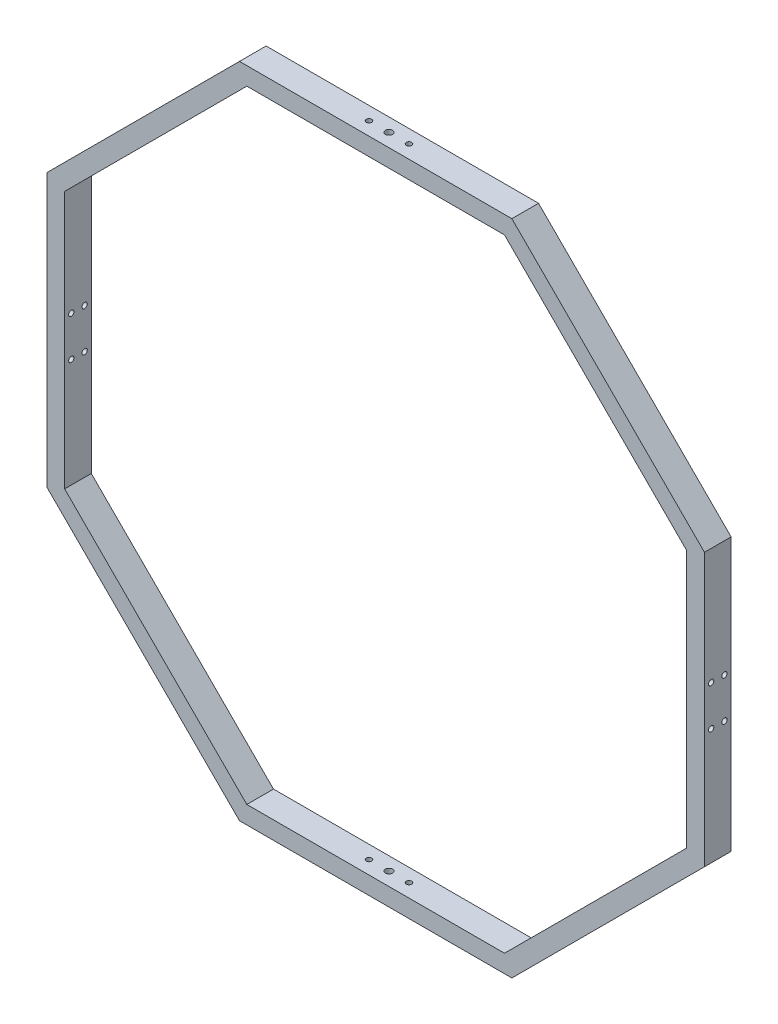
ISO-10303-21;
HEADER;
FILE_DESCRIPTION(('STEP AP214'),'2;1');
FILE_NAME('part.step','',(''),(''),'','','');
FILE_SCHEMA(('AUTOMOTIVE_DESIGN { 1 0 10303 214 1 1 1 1 }'));
ENDSEC;
DATA;
#1=APPLICATION_CONTEXT('core data for automotive mechanical design processes');
#2=APPLICATION_PROTOCOL_DEFINITION('international standard','automotive_design',2000,#1);
#3=PRODUCT_CONTEXT('',#1,'mechanical');
#4=PRODUCT('Part','Part','',(#3));
#5=PRODUCT_RELATED_PRODUCT_CATEGORY('part','',(#4));
#6=PRODUCT_DEFINITION_FORMATION('','',#4);
#7=PRODUCT_DEFINITION_CONTEXT('part definition',#1,'design');
#8=PRODUCT_DEFINITION('design','',#6,#7);
#9=PRODUCT_DEFINITION_SHAPE('','',#8);
#10=(LENGTH_UNIT() NAMED_UNIT(*) SI_UNIT(.MILLI.,.METRE.));
#11=(NAMED_UNIT(*) PLANE_ANGLE_UNIT() SI_UNIT($,.RADIAN.));
#12=(NAMED_UNIT(*) SI_UNIT($,.STERADIAN.) SOLID_ANGLE_UNIT());
#13=UNCERTAINTY_MEASURE_WITH_UNIT(LENGTH_MEASURE(1.E-05),#10,'distance_accuracy_value','');
#14=(GEOMETRIC_REPRESENTATION_CONTEXT(3) GLOBAL_UNCERTAINTY_ASSIGNED_CONTEXT((#13)) GLOBAL_UNIT_ASSIGNED_CONTEXT((#10,
#11,#12)) REPRESENTATION_CONTEXT('',''));
#15=CARTESIAN_POINT('',(0.,0.,0.));
#16=DIRECTION('',(0.,0.,1.));
#17=DIRECTION('',(1.,0.,0.));
#18=AXIS2_PLACEMENT_3D('',#15,#16,#17);
#19=CARTESIAN_POINT('',(0.,0.,60.));
#20=DIRECTION('',(0.,0.,1.));
#21=DIRECTION('',(1.,0.,0.));
#22=AXIS2_PLACEMENT_3D('',#19,#20,#21);
#23=PLANE('',#22);
#24=DIRECTION('',(0.,1.,0.));
#25=VECTOR('',#24,1.);
#26=CARTESIAN_POINT('',(740.,-306.51803615609,60.));
#27=LINE('',#26,#25);
#28=CARTESIAN_POINT('',(740.,-306.51803615609,60.));
#29=VERTEX_POINT('',#28);
#30=CARTESIAN_POINT('',(740.,306.51803615609,60.));
#31=VERTEX_POINT('',#30);
#32=EDGE_CURVE('E248',#29,#31,#27,.T.);
#33=ORIENTED_EDGE('',*,*,#32,.T.);
#34=DIRECTION('',(-0.707106781186547,0.707106781186547,0.));
#35=VECTOR('',#34,1.);
#36=CARTESIAN_POINT('',(740.,306.51803615609,60.));
#37=LINE('',#36,#35);
#38=CARTESIAN_POINT('',(306.51803615609,740.,60.));
#39=VERTEX_POINT('',#38);
#40=EDGE_CURVE('E252',#31,#39,#37,.T.);
#41=ORIENTED_EDGE('',*,*,#40,.T.);
#42=DIRECTION('',(-1.,0.,0.));
#43=VECTOR('',#42,1.);
#44=CARTESIAN_POINT('',(306.51803615609,740.,60.));
#45=LINE('',#44,#43);
#46=CARTESIAN_POINT('',(-306.51803615609,740.,60.));
#47=VERTEX_POINT('',#46);
#48=EDGE_CURVE('E256',#39,#47,#45,.T.);
#49=ORIENTED_EDGE('',*,*,#48,.T.);
#50=DIRECTION('',(-0.707106781186548,-0.707106781186547,0.));
#51=VECTOR('',#50,1.);
#52=CARTESIAN_POINT('',(-306.51803615609,740.,60.));
#53=LINE('',#52,#51);
#54=CARTESIAN_POINT('',(-740.,306.51803615609,60.));
#55=VERTEX_POINT('',#54);
#56=EDGE_CURVE('E259',#47,#55,#53,.T.);
#57=ORIENTED_EDGE('',*,*,#56,.T.);
#58=DIRECTION('',(0.,-1.,0.));
#59=VECTOR('',#58,1.);
#60=CARTESIAN_POINT('',(-740.,306.51803615609,60.));
#61=LINE('',#60,#59);
#62=CARTESIAN_POINT('',(-740.,-306.518036156091,60.));
#63=VERTEX_POINT('',#62);
#64=EDGE_CURVE('E262',#55,#63,#61,.T.);
#65=ORIENTED_EDGE('',*,*,#64,.T.);
#66=DIRECTION('',(0.707106781186548,-0.707106781186547,0.));
#67=VECTOR('',#66,1.);
#68=CARTESIAN_POINT('',(-740.,-306.518036156091,60.));
#69=LINE('',#68,#67);
#70=CARTESIAN_POINT('',(-306.51803615609,-740.,60.));
#71=VERTEX_POINT('',#70);
#72=EDGE_CURVE('E265',#63,#71,#69,.T.);
#73=ORIENTED_EDGE('',*,*,#72,.T.);
#74=DIRECTION('',(1.,0.,0.));
#75=VECTOR('',#74,1.);
#76=CARTESIAN_POINT('',(-306.51803615609,-740.,60.));
#77=LINE('',#76,#75);
#78=CARTESIAN_POINT('',(306.51803615609,-740.,60.));
#79=VERTEX_POINT('',#78);
#80=EDGE_CURVE('E268',#71,#79,#77,.T.);
#81=ORIENTED_EDGE('',*,*,#80,.T.);
#82=DIRECTION('',(0.707106781186548,0.707106781186548,0.));
#83=VECTOR('',#82,1.);
#84=CARTESIAN_POINT('',(306.51803615609,-740.,60.));
#85=LINE('',#84,#83);
#86=EDGE_CURVE('E271',#79,#29,#85,.T.);
#87=ORIENTED_EDGE('',*,*,#86,.T.);
#88=EDGE_LOOP('',(#33,#41,#49,#57,#65,#73,#81,#87));
#89=FACE_BOUND('',#88,.T.);
#90=DIRECTION('',(0.,1.,0.));
#91=VECTOR('',#90,1.);
#92=CARTESIAN_POINT('',(700.,-289.949493661166,60.));
#93=LINE('',#92,#91);
#94=CARTESIAN_POINT('',(700.,-289.949493661166,60.));
#95=VERTEX_POINT('',#94);
#96=CARTESIAN_POINT('',(700.,289.949493661167,60.));
#97=VERTEX_POINT('',#96);
#98=EDGE_CURVE('E165',#95,#97,#93,.T.);
#99=ORIENTED_EDGE('',*,*,#98,.F.);
#100=DIRECTION('',(0.707106781186547,0.707106781186548,0.));
#101=VECTOR('',#100,1.);
#102=CARTESIAN_POINT('',(289.949493661166,-700.,60.));
#103=LINE('',#102,#101);
#104=CARTESIAN_POINT('',(289.949493661166,-700.,60.));
#105=VERTEX_POINT('',#104);
#106=EDGE_CURVE('E156',#105,#95,#103,.T.);
#107=ORIENTED_EDGE('',*,*,#106,.F.);
#108=DIRECTION('',(1.,0.,0.));
#109=VECTOR('',#108,1.);
#110=CARTESIAN_POINT('',(-289.949493661166,-700.,60.));
#111=LINE('',#110,#109);
#112=CARTESIAN_POINT('',(-289.949493661166,-700.,60.));
#113=VERTEX_POINT('',#112);
#114=EDGE_CURVE('E199',#113,#105,#111,.T.);
#115=ORIENTED_EDGE('',*,*,#114,.F.);
#116=DIRECTION('',(0.707106781186548,-0.707106781186547,0.));
#117=VECTOR('',#116,1.);
#118=CARTESIAN_POINT('',(-700.,-289.949493661167,60.));
#119=LINE('',#118,#117);
#120=CARTESIAN_POINT('',(-700.,-289.949493661167,60.));
#121=VERTEX_POINT('',#120);
#122=EDGE_CURVE('E196',#121,#113,#119,.T.);
#123=ORIENTED_EDGE('',*,*,#122,.F.);
#124=DIRECTION('',(0.,-1.,0.));
#125=VECTOR('',#124,1.);
#126=CARTESIAN_POINT('',(-700.,289.949493661166,60.));
#127=LINE('',#126,#125);
#128=CARTESIAN_POINT('',(-700.,289.949493661166,60.));
#129=VERTEX_POINT('',#128);
#130=EDGE_CURVE('E193',#129,#121,#127,.T.);
#131=ORIENTED_EDGE('',*,*,#130,.F.);
#132=DIRECTION('',(-0.707106781186547,-0.707106781186548,0.));
#133=VECTOR('',#132,1.);
#134=CARTESIAN_POINT('',(-289.949493661167,700.,60.));
#135=LINE('',#134,#133);
#136=CARTESIAN_POINT('',(-289.949493661167,700.,60.));
#137=VERTEX_POINT('',#136);
#138=EDGE_CURVE('E190',#137,#129,#135,.T.);
#139=ORIENTED_EDGE('',*,*,#138,.F.);
#140=DIRECTION('',(-1.,0.,0.));
#141=VECTOR('',#140,1.);
#142=CARTESIAN_POINT('',(289.949493661166,700.,60.));
#143=LINE('',#142,#141);
#144=CARTESIAN_POINT('',(289.949493661166,700.,60.));
#145=VERTEX_POINT('',#144);
#146=EDGE_CURVE('E184',#145,#137,#143,.T.);
#147=ORIENTED_EDGE('',*,*,#146,.F.);
#148=DIRECTION('',(-0.707106781186548,0.707106781186547,0.));
#149=VECTOR('',#148,1.);
#150=CARTESIAN_POINT('',(700.,289.949493661167,60.));
#151=LINE('',#150,#149);
#152=EDGE_CURVE('E179',#97,#145,#151,.T.);
#153=ORIENTED_EDGE('',*,*,#152,.F.);
#154=EDGE_LOOP('',(#99,#107,#115,#123,#131,#139,#147,#153));
#155=FACE_BOUND('',#154,.T.);
#156=ADVANCED_FACE('F40',(#89,#155),#23,.T.);
#157=CARTESIAN_POINT('',(0.,0.,0.));
#158=DIRECTION('',(0.,0.,1.));
#159=DIRECTION('',(1.,0.,0.));
#160=AXIS2_PLACEMENT_3D('',#157,#158,#159);
#161=PLANE('',#160);
#162=DIRECTION('',(0.,1.,0.));
#163=VECTOR('',#162,1.);
#164=CARTESIAN_POINT('',(740.,-306.51803615609,0.));
#165=LINE('',#164,#163);
#166=CARTESIAN_POINT('',(740.,-306.51803615609,0.));
#167=VERTEX_POINT('',#166);
#168=CARTESIAN_POINT('',(740.,306.51803615609,0.));
#169=VERTEX_POINT('',#168);
#170=EDGE_CURVE('E174',#167,#169,#165,.T.);
#171=ORIENTED_EDGE('',*,*,#170,.F.);
#172=DIRECTION('',(0.707106781186548,0.707106781186548,0.));
#173=VECTOR('',#172,1.);
#174=CARTESIAN_POINT('',(306.51803615609,-740.,0.));
#175=LINE('',#174,#173);
#176=CARTESIAN_POINT('',(306.51803615609,-740.,0.));
#177=VERTEX_POINT('',#176);
#178=EDGE_CURVE('E253',#177,#167,#175,.T.);
#179=ORIENTED_EDGE('',*,*,#178,.F.);
#180=DIRECTION('',(1.,0.,0.));
#181=VECTOR('',#180,1.);
#182=CARTESIAN_POINT('',(-306.51803615609,-740.,0.));
#183=LINE('',#182,#181);
#184=CARTESIAN_POINT('',(-306.51803615609,-740.,0.));
#185=VERTEX_POINT('',#184);
#186=EDGE_CURVE('E293',#185,#177,#183,.T.);
#187=ORIENTED_EDGE('',*,*,#186,.F.);
#188=DIRECTION('',(0.707106781186548,-0.707106781186547,0.));
#189=VECTOR('',#188,1.);
#190=CARTESIAN_POINT('',(-740.,-306.518036156091,0.));
#191=LINE('',#190,#189);
#192=CARTESIAN_POINT('',(-740.,-306.518036156091,0.));
#193=VERTEX_POINT('',#192);
#194=EDGE_CURVE('E290',#193,#185,#191,.T.);
#195=ORIENTED_EDGE('',*,*,#194,.F.);
#196=DIRECTION('',(0.,-1.,0.));
#197=VECTOR('',#196,1.);
#198=CARTESIAN_POINT('',(-740.,306.51803615609,0.));
#199=LINE('',#198,#197);
#200=CARTESIAN_POINT('',(-740.,306.51803615609,0.));
#201=VERTEX_POINT('',#200);
#202=EDGE_CURVE('E287',#201,#193,#199,.T.);
#203=ORIENTED_EDGE('',*,*,#202,.F.);
#204=DIRECTION('',(-0.707106781186548,-0.707106781186547,0.));
#205=VECTOR('',#204,1.);
#206=CARTESIAN_POINT('',(-306.51803615609,740.,0.));
#207=LINE('',#206,#205);
#208=CARTESIAN_POINT('',(-306.51803615609,740.,0.));
#209=VERTEX_POINT('',#208);
#210=EDGE_CURVE('E284',#209,#201,#207,.T.);
#211=ORIENTED_EDGE('',*,*,#210,.F.);
#212=DIRECTION('',(-1.,0.,0.));
#213=VECTOR('',#212,1.);
#214=CARTESIAN_POINT('',(306.51803615609,740.,0.));
#215=LINE('',#214,#213);
#216=CARTESIAN_POINT('',(306.51803615609,740.,0.));
#217=VERTEX_POINT('',#216);
#218=EDGE_CURVE('E281',#217,#209,#215,.T.);
#219=ORIENTED_EDGE('',*,*,#218,.F.);
#220=DIRECTION('',(-0.707106781186547,0.707106781186547,0.));
#221=VECTOR('',#220,1.);
#222=CARTESIAN_POINT('',(740.,306.51803615609,0.));
#223=LINE('',#222,#221);
#224=EDGE_CURVE('E278',#169,#217,#223,.T.);
#225=ORIENTED_EDGE('',*,*,#224,.F.);
#226=EDGE_LOOP('',(#171,#179,#187,#195,#203,#211,#219,#225));
#227=FACE_BOUND('',#226,.T.);
#228=DIRECTION('',(0.707106781186547,0.707106781186548,0.));
#229=VECTOR('',#228,1.);
#230=CARTESIAN_POINT('',(289.949493661166,-700.,0.));
#231=LINE('',#230,#229);
#232=CARTESIAN_POINT('',(289.949493661166,-700.,0.));
#233=VERTEX_POINT('',#232);
#234=CARTESIAN_POINT('',(700.,-289.949493661166,0.));
#235=VERTEX_POINT('',#234);
#236=EDGE_CURVE('E66',#233,#235,#231,.T.);
#237=ORIENTED_EDGE('',*,*,#236,.T.);
#238=DIRECTION('',(0.,1.,0.));
#239=VECTOR('',#238,1.);
#240=CARTESIAN_POINT('',(700.,-289.949493661166,0.));
#241=LINE('',#240,#239);
#242=CARTESIAN_POINT('',(700.,289.949493661167,0.));
#243=VERTEX_POINT('',#242);
#244=EDGE_CURVE('E172',#235,#243,#241,.T.);
#245=ORIENTED_EDGE('',*,*,#244,.T.);
#246=DIRECTION('',(-0.707106781186548,0.707106781186547,0.));
#247=VECTOR('',#246,1.);
#248=CARTESIAN_POINT('',(700.,289.949493661167,0.));
#249=LINE('',#248,#247);
#250=CARTESIAN_POINT('',(289.949493661166,700.,0.));
#251=VERTEX_POINT('',#250);
#252=EDGE_CURVE('E207',#243,#251,#249,.T.);
#253=ORIENTED_EDGE('',*,*,#252,.T.);
#254=DIRECTION('',(-1.,0.,0.));
#255=VECTOR('',#254,1.);
#256=CARTESIAN_POINT('',(289.949493661166,700.,0.));
#257=LINE('',#256,#255);
#258=CARTESIAN_POINT('',(-289.949493661167,700.,0.));
#259=VERTEX_POINT('',#258);
#260=EDGE_CURVE('E211',#251,#259,#257,.T.);
#261=ORIENTED_EDGE('',*,*,#260,.T.);
#262=DIRECTION('',(-0.707106781186547,-0.707106781186548,0.));
#263=VECTOR('',#262,1.);
#264=CARTESIAN_POINT('',(-289.949493661167,700.,0.));
#265=LINE('',#264,#263);
#266=CARTESIAN_POINT('',(-700.,289.949493661166,0.));
#267=VERTEX_POINT('',#266);
#268=EDGE_CURVE('E215',#259,#267,#265,.T.);
#269=ORIENTED_EDGE('',*,*,#268,.T.);
#270=DIRECTION('',(0.,-1.,0.));
#271=VECTOR('',#270,1.);
#272=CARTESIAN_POINT('',(-700.,289.949493661166,0.));
#273=LINE('',#272,#271);
#274=CARTESIAN_POINT('',(-700.,-289.949493661167,0.));
#275=VERTEX_POINT('',#274);
#276=EDGE_CURVE('E219',#267,#275,#273,.T.);
#277=ORIENTED_EDGE('',*,*,#276,.T.);
#278=DIRECTION('',(0.707106781186548,-0.707106781186547,0.));
#279=VECTOR('',#278,1.);
#280=CARTESIAN_POINT('',(-700.,-289.949493661167,0.));
#281=LINE('',#280,#279);
#282=CARTESIAN_POINT('',(-289.949493661166,-700.,0.));
#283=VERTEX_POINT('',#282);
#284=EDGE_CURVE('E223',#275,#283,#281,.T.);
#285=ORIENTED_EDGE('',*,*,#284,.T.);
#286=DIRECTION('',(1.,0.,0.));
#287=VECTOR('',#286,1.);
#288=CARTESIAN_POINT('',(-289.949493661166,-700.,0.));
#289=LINE('',#288,#287);
#290=EDGE_CURVE('E166',#283,#233,#289,.T.);
#291=ORIENTED_EDGE('',*,*,#290,.T.);
#292=EDGE_LOOP('',(#237,#245,#253,#261,#269,#277,#285,#291));
#293=FACE_BOUND('',#292,.T.);
#294=ADVANCED_FACE('F444',(#227,#293),#161,.F.);
#295=CARTESIAN_POINT('',(740.,-306.51803615609,60.));
#296=DIRECTION('',(-1.,0.,0.));
#297=DIRECTION('',(0.,0.,1.));
#298=AXIS2_PLACEMENT_3D('',#295,#296,#297);
#299=PLANE('',#298);
#300=CARTESIAN_POINT('',(740.,-45.,15.));
#301=DIRECTION('',(1.,0.,0.));
#302=DIRECTION('',(0.,0.,-1.));
#303=AXIS2_PLACEMENT_3D('',#300,#301,#302);
#304=CIRCLE('',#303,6.);
#305=CARTESIAN_POINT('',(740.,-45.,8.99999999999999));
#306=VERTEX_POINT('',#305);
#307=EDGE_CURVE('E657',#306,#306,#304,.T.);
#308=ORIENTED_EDGE('',*,*,#307,.F.);
#309=EDGE_LOOP('',(#308));
#310=FACE_BOUND('',#309,.T.);
#311=CARTESIAN_POINT('',(740.,45.,45.));
#312=DIRECTION('',(1.,0.,0.));
#313=DIRECTION('',(0.,0.,-1.));
#314=AXIS2_PLACEMENT_3D('',#311,#312,#313);
#315=CIRCLE('',#314,6.);
#316=CARTESIAN_POINT('',(740.,45.,39.));
#317=VERTEX_POINT('',#316);
#318=EDGE_CURVE('E659',#317,#317,#315,.T.);
#319=ORIENTED_EDGE('',*,*,#318,.F.);
#320=EDGE_LOOP('',(#319));
#321=FACE_BOUND('',#320,.T.);
#322=CARTESIAN_POINT('',(740.,-45.,45.));
#323=DIRECTION('',(1.,0.,0.));
#324=DIRECTION('',(0.,0.,-1.));
#325=AXIS2_PLACEMENT_3D('',#322,#323,#324);
#326=CIRCLE('',#325,6.);
#327=CARTESIAN_POINT('',(740.,-45.,39.));
#328=VERTEX_POINT('',#327);
#329=EDGE_CURVE('E667',#328,#328,#326,.T.);
#330=ORIENTED_EDGE('',*,*,#329,.F.);
#331=EDGE_LOOP('',(#330));
#332=FACE_BOUND('',#331,.T.);
#333=CARTESIAN_POINT('',(740.,45.,15.));
#334=DIRECTION('',(1.,0.,0.));
#335=DIRECTION('',(0.,0.,-1.));
#336=AXIS2_PLACEMENT_3D('',#333,#334,#335);
#337=CIRCLE('',#336,6.);
#338=CARTESIAN_POINT('',(740.,45.,9.));
#339=VERTEX_POINT('',#338);
#340=EDGE_CURVE('E347',#339,#339,#337,.T.);
#341=ORIENTED_EDGE('',*,*,#340,.F.);
#342=EDGE_LOOP('',(#341));
#343=FACE_BOUND('',#342,.T.);
#344=ORIENTED_EDGE('',*,*,#170,.T.);
#345=DIRECTION('',(0.,0.,-1.));
#346=VECTOR('',#345,1.);
#347=CARTESIAN_POINT('',(740.,306.51803615609,60.));
#348=LINE('',#347,#346);
#349=EDGE_CURVE('E11',#31,#169,#348,.T.);
#350=ORIENTED_EDGE('',*,*,#349,.F.);
#351=ORIENTED_EDGE('',*,*,#32,.F.);
#352=DIRECTION('',(0.,0.,-1.));
#353=VECTOR('',#352,1.);
#354=CARTESIAN_POINT('',(740.,-306.51803615609,60.));
#355=LINE('',#354,#353);
#356=EDGE_CURVE('E274',#29,#167,#355,.T.);
#357=ORIENTED_EDGE('',*,*,#356,.T.);
#358=EDGE_LOOP('',(#344,#350,#351,#357));
#359=FACE_BOUND('',#358,.T.);
#360=ADVANCED_FACE('F42',(#310,#321,#332,#343,#359),#299,.F.);
#361=CARTESIAN_POINT('',(740.,306.51803615609,60.));
#362=DIRECTION('',(-0.707106781186547,-0.707106781186547,0.));
#363=DIRECTION('',(0.707106781186548,-0.707106781186548,0.));
#364=AXIS2_PLACEMENT_3D('',#361,#362,#363);
#365=PLANE('',#364);
#366=ORIENTED_EDGE('',*,*,#224,.T.);
#367=DIRECTION('',(0.,0.,-1.));
#368=VECTOR('',#367,1.);
#369=CARTESIAN_POINT('',(306.51803615609,740.,60.));
#370=LINE('',#369,#368);
#371=EDGE_CURVE('E50',#39,#217,#370,.T.);
#372=ORIENTED_EDGE('',*,*,#371,.F.);
#373=ORIENTED_EDGE('',*,*,#40,.F.);
#374=ORIENTED_EDGE('',*,*,#349,.T.);
#375=EDGE_LOOP('',(#366,#372,#373,#374));
#376=FACE_BOUND('',#375,.T.);
#377=ADVANCED_FACE('F476',(#376),#365,.F.);
#378=CARTESIAN_POINT('',(306.51803615609,740.,60.));
#379=DIRECTION('',(0.,-1.,0.));
#380=DIRECTION('',(0.,0.,-1.));
#381=AXIS2_PLACEMENT_3D('',#378,#379,#380);
#382=PLANE('',#381);
#383=CARTESIAN_POINT('',(45.,740.,30.));
#384=DIRECTION('',(0.,-1.,0.));
#385=DIRECTION('',(0.,0.,-1.));
#386=AXIS2_PLACEMENT_3D('',#383,#384,#385);
#387=CIRCLE('',#386,6.);
#388=CARTESIAN_POINT('',(45.,740.,24.));
#389=VERTEX_POINT('',#388);
#390=EDGE_CURVE('E204',#389,#389,#387,.T.);
#391=ORIENTED_EDGE('',*,*,#390,.T.);
#392=EDGE_LOOP('',(#391));
#393=FACE_BOUND('',#392,.T.);
#394=CARTESIAN_POINT('',(-45.,740.,30.));
#395=DIRECTION('',(0.,-1.,0.));
#396=DIRECTION('',(0.,0.,-1.));
#397=AXIS2_PLACEMENT_3D('',#394,#395,#396);
#398=CIRCLE('',#397,6.);
#399=CARTESIAN_POINT('',(-45.,740.,24.));
#400=VERTEX_POINT('',#399);
#401=EDGE_CURVE('E341',#400,#400,#398,.T.);
#402=ORIENTED_EDGE('',*,*,#401,.T.);
#403=EDGE_LOOP('',(#402));
#404=FACE_BOUND('',#403,.T.);
#405=CARTESIAN_POINT('',(0.,740.,30.));
#406=DIRECTION('',(0.,-1.,0.));
#407=DIRECTION('',(0.,0.,-1.));
#408=AXIS2_PLACEMENT_3D('',#405,#406,#407);
#409=CIRCLE('',#408,8.);
#410=CARTESIAN_POINT('',(0.,740.,22.));
#411=VERTEX_POINT('',#410);
#412=EDGE_CURVE('E335',#411,#411,#409,.T.);
#413=ORIENTED_EDGE('',*,*,#412,.T.);
#414=EDGE_LOOP('',(#413));
#415=FACE_BOUND('',#414,.T.);
#416=ORIENTED_EDGE('',*,*,#218,.T.);
#417=DIRECTION('',(0.,0.,-1.));
#418=VECTOR('',#417,1.);
#419=CARTESIAN_POINT('',(-306.51803615609,740.,60.));
#420=LINE('',#419,#418);
#421=EDGE_CURVE('E317',#47,#209,#420,.T.);
#422=ORIENTED_EDGE('',*,*,#421,.F.);
#423=ORIENTED_EDGE('',*,*,#48,.F.);
#424=ORIENTED_EDGE('',*,*,#371,.T.);
#425=EDGE_LOOP('',(#416,#422,#423,#424));
#426=FACE_BOUND('',#425,.T.);
#427=ADVANCED_FACE('F417',(#393,#404,#415,#426),#382,.F.);
#428=CARTESIAN_POINT('',(-306.51803615609,740.,60.));
#429=DIRECTION('',(0.707106781186547,-0.707106781186548,0.));
#430=DIRECTION('',(0.707106781186548,0.707106781186547,0.));
#431=AXIS2_PLACEMENT_3D('',#428,#429,#430);
#432=PLANE('',#431);
#433=ORIENTED_EDGE('',*,*,#210,.T.);
#434=DIRECTION('',(0.,0.,-1.));
#435=VECTOR('',#434,1.);
#436=CARTESIAN_POINT('',(-740.,306.51803615609,60.));
#437=LINE('',#436,#435);
#438=EDGE_CURVE('E313',#55,#201,#437,.T.);
#439=ORIENTED_EDGE('',*,*,#438,.F.);
#440=ORIENTED_EDGE('',*,*,#56,.F.);
#441=ORIENTED_EDGE('',*,*,#421,.T.);
#442=EDGE_LOOP('',(#433,#439,#440,#441));
#443=FACE_BOUND('',#442,.T.);
#444=ADVANCED_FACE('F470',(#443),#432,.F.);
#445=CARTESIAN_POINT('',(-740.,306.51803615609,60.));
#446=DIRECTION('',(1.,0.,0.));
#447=DIRECTION('',(0.,0.,-1.));
#448=AXIS2_PLACEMENT_3D('',#445,#446,#447);
#449=PLANE('',#448);
#450=CARTESIAN_POINT('',(-740.,-45.,15.));
#451=DIRECTION('',(1.,0.,0.));
#452=DIRECTION('',(0.,0.,-1.));
#453=AXIS2_PLACEMENT_3D('',#450,#451,#452);
#454=CIRCLE('',#453,6.);
#455=CARTESIAN_POINT('',(-740.,-45.,8.99999999999999));
#456=VERTEX_POINT('',#455);
#457=EDGE_CURVE('E383',#456,#456,#454,.T.);
#458=ORIENTED_EDGE('',*,*,#457,.T.);
#459=EDGE_LOOP('',(#458));
#460=FACE_BOUND('',#459,.T.);
#461=CARTESIAN_POINT('',(-740.,45.,45.));
#462=DIRECTION('',(1.,0.,0.));
#463=DIRECTION('',(0.,0.,-1.));
#464=AXIS2_PLACEMENT_3D('',#461,#462,#463);
#465=CIRCLE('',#464,6.);
#466=CARTESIAN_POINT('',(-740.,45.,39.));
#467=VERTEX_POINT('',#466);
#468=EDGE_CURVE('E364',#467,#467,#465,.T.);
#469=ORIENTED_EDGE('',*,*,#468,.T.);
#470=EDGE_LOOP('',(#469));
#471=FACE_BOUND('',#470,.T.);
#472=CARTESIAN_POINT('',(-740.,-45.,45.));
#473=DIRECTION('',(1.,0.,0.));
#474=DIRECTION('',(0.,0.,-1.));
#475=AXIS2_PLACEMENT_3D('',#472,#473,#474);
#476=CIRCLE('',#475,6.);
#477=CARTESIAN_POINT('',(-740.,-45.,39.));
#478=VERTEX_POINT('',#477);
#479=EDGE_CURVE('E357',#478,#478,#476,.T.);
#480=ORIENTED_EDGE('',*,*,#479,.T.);
#481=EDGE_LOOP('',(#480));
#482=FACE_BOUND('',#481,.T.);
#483=CARTESIAN_POINT('',(-740.,45.,15.));
#484=DIRECTION('',(1.,0.,0.));
#485=DIRECTION('',(0.,0.,-1.));
#486=AXIS2_PLACEMENT_3D('',#483,#484,#485);
#487=CIRCLE('',#486,6.);
#488=CARTESIAN_POINT('',(-740.,45.,9.));
#489=VERTEX_POINT('',#488);
#490=EDGE_CURVE('E352',#489,#489,#487,.T.);
#491=ORIENTED_EDGE('',*,*,#490,.T.);
#492=EDGE_LOOP('',(#491));
#493=FACE_BOUND('',#492,.T.);
#494=ORIENTED_EDGE('',*,*,#202,.T.);
#495=DIRECTION('',(0.,0.,-1.));
#496=VECTOR('',#495,1.);
#497=CARTESIAN_POINT('',(-740.,-306.518036156091,60.));
#498=LINE('',#497,#496);
#499=EDGE_CURVE('E309',#63,#193,#498,.T.);
#500=ORIENTED_EDGE('',*,*,#499,.F.);
#501=ORIENTED_EDGE('',*,*,#64,.F.);
#502=ORIENTED_EDGE('',*,*,#438,.T.);
#503=EDGE_LOOP('',(#494,#500,#501,#502));
#504=FACE_BOUND('',#503,.T.);
#505=ADVANCED_FACE('F466',(#460,#471,#482,#493,#504),#449,.F.);
#506=CARTESIAN_POINT('',(-740.,-306.518036156091,60.));
#507=DIRECTION('',(0.707106781186547,0.707106781186548,0.));
#508=DIRECTION('',(-0.707106781186548,0.707106781186547,0.));
#509=AXIS2_PLACEMENT_3D('',#506,#507,#508);
#510=PLANE('',#509);
#511=ORIENTED_EDGE('',*,*,#194,.T.);
#512=DIRECTION('',(0.,0.,-1.));
#513=VECTOR('',#512,1.);
#514=CARTESIAN_POINT('',(-306.51803615609,-740.,60.));
#515=LINE('',#514,#513);
#516=EDGE_CURVE('E305',#71,#185,#515,.T.);
#517=ORIENTED_EDGE('',*,*,#516,.F.);
#518=ORIENTED_EDGE('',*,*,#72,.F.);
#519=ORIENTED_EDGE('',*,*,#499,.T.);
#520=EDGE_LOOP('',(#511,#517,#518,#519));
#521=FACE_BOUND('',#520,.T.);
#522=ADVANCED_FACE('F462',(#521),#510,.F.);
#523=CARTESIAN_POINT('',(-306.51803615609,-740.,60.));
#524=DIRECTION('',(0.,1.,0.));
#525=DIRECTION('',(0.,0.,1.));
#526=AXIS2_PLACEMENT_3D('',#523,#524,#525);
#527=PLANE('',#526);
#528=CARTESIAN_POINT('',(45.,-740.,30.));
#529=DIRECTION('',(0.,-1.,0.));
#530=DIRECTION('',(0.,0.,-1.));
#531=AXIS2_PLACEMENT_3D('',#528,#529,#530);
#532=CIRCLE('',#531,6.);
#533=CARTESIAN_POINT('',(45.,-740.,24.));
#534=VERTEX_POINT('',#533);
#535=EDGE_CURVE('E387',#534,#534,#532,.T.);
#536=ORIENTED_EDGE('',*,*,#535,.F.);
#537=EDGE_LOOP('',(#536));
#538=FACE_BOUND('',#537,.T.);
#539=CARTESIAN_POINT('',(-45.,-740.,30.));
#540=DIRECTION('',(0.,-1.,0.));
#541=DIRECTION('',(0.,0.,-1.));
#542=AXIS2_PLACEMENT_3D('',#539,#540,#541);
#543=CIRCLE('',#542,6.);
#544=CARTESIAN_POINT('',(-45.,-740.,24.));
#545=VERTEX_POINT('',#544);
#546=EDGE_CURVE('E388',#545,#545,#543,.T.);
#547=ORIENTED_EDGE('',*,*,#546,.F.);
#548=EDGE_LOOP('',(#547));
#549=FACE_BOUND('',#548,.T.);
#550=CARTESIAN_POINT('',(0.,-740.,30.));
#551=DIRECTION('',(0.,-1.,0.));
#552=DIRECTION('',(0.,0.,-1.));
#553=AXIS2_PLACEMENT_3D('',#550,#551,#552);
#554=CIRCLE('',#553,8.);
#555=CARTESIAN_POINT('',(0.,-740.,22.));
#556=VERTEX_POINT('',#555);
#557=EDGE_CURVE('E329',#556,#556,#554,.T.);
#558=ORIENTED_EDGE('',*,*,#557,.F.);
#559=EDGE_LOOP('',(#558));
#560=FACE_BOUND('',#559,.T.);
#561=ORIENTED_EDGE('',*,*,#186,.T.);
#562=DIRECTION('',(0.,0.,-1.));
#563=VECTOR('',#562,1.);
#564=CARTESIAN_POINT('',(306.51803615609,-740.,60.));
#565=LINE('',#564,#563);
#566=EDGE_CURVE('E301',#79,#177,#565,.T.);
#567=ORIENTED_EDGE('',*,*,#566,.F.);
#568=ORIENTED_EDGE('',*,*,#80,.F.);
#569=ORIENTED_EDGE('',*,*,#516,.T.);
#570=EDGE_LOOP('',(#561,#567,#568,#569));
#571=FACE_BOUND('',#570,.T.);
#572=ADVANCED_FACE('F458',(#538,#549,#560,#571),#527,.F.);
#573=CARTESIAN_POINT('',(306.51803615609,-740.,60.));
#574=DIRECTION('',(-0.707106781186547,0.707106781186547,0.));
#575=DIRECTION('',(-0.707106781186548,-0.707106781186548,0.));
#576=AXIS2_PLACEMENT_3D('',#573,#574,#575);
#577=PLANE('',#576);
#578=ORIENTED_EDGE('',*,*,#178,.T.);
#579=ORIENTED_EDGE('',*,*,#356,.F.);
#580=ORIENTED_EDGE('',*,*,#86,.F.);
#581=ORIENTED_EDGE('',*,*,#566,.T.);
#582=EDGE_LOOP('',(#578,#579,#580,#581));
#583=FACE_BOUND('',#582,.T.);
#584=ADVANCED_FACE('F455',(#583),#577,.F.);
#585=CARTESIAN_POINT('',(289.949493661166,-700.,60.));
#586=DIRECTION('',(-0.707106781186548,0.707106781186547,0.));
#587=DIRECTION('',(-0.707106781186547,-0.707106781186548,0.));
#588=AXIS2_PLACEMENT_3D('',#585,#586,#587);
#589=PLANE('',#588);
#590=ORIENTED_EDGE('',*,*,#236,.F.);
#591=DIRECTION('',(0.,0.,-1.));
#592=VECTOR('',#591,1.);
#593=CARTESIAN_POINT('',(289.949493661166,-700.,60.));
#594=LINE('',#593,#592);
#595=EDGE_CURVE('E160',#105,#233,#594,.T.);
#596=ORIENTED_EDGE('',*,*,#595,.F.);
#597=ORIENTED_EDGE('',*,*,#106,.T.);
#598=DIRECTION('',(0.,0.,-1.));
#599=VECTOR('',#598,1.);
#600=CARTESIAN_POINT('',(700.,-289.949493661166,60.));
#601=LINE('',#600,#599);
#602=EDGE_CURVE('E159',#95,#235,#601,.T.);
#603=ORIENTED_EDGE('',*,*,#602,.T.);
#604=EDGE_LOOP('',(#590,#596,#597,#603));
#605=FACE_BOUND('',#604,.T.);
#606=ADVANCED_FACE('F158',(#605),#589,.T.);
#607=CARTESIAN_POINT('',(700.,-289.949493661166,60.));
#608=DIRECTION('',(-1.,0.,0.));
#609=DIRECTION('',(0.,-1.,0.));
#610=AXIS2_PLACEMENT_3D('',#607,#608,#609);
#611=PLANE('',#610);
#612=CARTESIAN_POINT('',(700.,-45.,15.));
#613=DIRECTION('',(-1.,0.,0.));
#614=DIRECTION('',(0.,-1.,0.));
#615=AXIS2_PLACEMENT_3D('',#612,#613,#614);
#616=CIRCLE('',#615,6.);
#617=CARTESIAN_POINT('',(700.,-51.,15.));
#618=VERTEX_POINT('',#617);
#619=EDGE_CURVE('E379',#618,#618,#616,.T.);
#620=ORIENTED_EDGE('',*,*,#619,.F.);
#621=EDGE_LOOP('',(#620));
#622=FACE_BOUND('',#621,.T.);
#623=CARTESIAN_POINT('',(700.,45.,45.));
#624=DIRECTION('',(-1.,0.,0.));
#625=DIRECTION('',(0.,-1.,0.));
#626=AXIS2_PLACEMENT_3D('',#623,#624,#625);
#627=CIRCLE('',#626,6.);
#628=CARTESIAN_POINT('',(700.,39.,45.));
#629=VERTEX_POINT('',#628);
#630=EDGE_CURVE('E356',#629,#629,#627,.T.);
#631=ORIENTED_EDGE('',*,*,#630,.F.);
#632=EDGE_LOOP('',(#631));
#633=FACE_BOUND('',#632,.T.);
#634=CARTESIAN_POINT('',(700.,-45.,45.));
#635=DIRECTION('',(-1.,0.,0.));
#636=DIRECTION('',(0.,-1.,0.));
#637=AXIS2_PLACEMENT_3D('',#634,#635,#636);
#638=CIRCLE('',#637,6.);
#639=CARTESIAN_POINT('',(700.,-51.,45.));
#640=VERTEX_POINT('',#639);
#641=EDGE_CURVE('E351',#640,#640,#638,.T.);
#642=ORIENTED_EDGE('',*,*,#641,.F.);
#643=EDGE_LOOP('',(#642));
#644=FACE_BOUND('',#643,.T.);
#645=CARTESIAN_POINT('',(700.,45.,15.));
#646=DIRECTION('',(-1.,0.,0.));
#647=DIRECTION('',(0.,-1.,0.));
#648=AXIS2_PLACEMENT_3D('',#645,#646,#647);
#649=CIRCLE('',#648,6.);
#650=CARTESIAN_POINT('',(700.,39.,15.));
#651=VERTEX_POINT('',#650);
#652=EDGE_CURVE('E346',#651,#651,#649,.T.);
#653=ORIENTED_EDGE('',*,*,#652,.F.);
#654=EDGE_LOOP('',(#653));
#655=FACE_BOUND('',#654,.T.);
#656=ORIENTED_EDGE('',*,*,#244,.F.);
#657=ORIENTED_EDGE('',*,*,#602,.F.);
#658=ORIENTED_EDGE('',*,*,#98,.T.);
#659=DIRECTION('',(0.,0.,-1.));
#660=VECTOR('',#659,1.);
#661=CARTESIAN_POINT('',(700.,289.949493661167,60.));
#662=LINE('',#661,#660);
#663=EDGE_CURVE('E175',#97,#243,#662,.T.);
#664=ORIENTED_EDGE('',*,*,#663,.T.);
#665=EDGE_LOOP('',(#656,#657,#658,#664));
#666=FACE_BOUND('',#665,.T.);
#667=ADVANCED_FACE('F169',(#622,#633,#644,#655,#666),#611,.T.);
#668=CARTESIAN_POINT('',(700.,289.949493661167,60.));
#669=DIRECTION('',(-0.707106781186547,-0.707106781186548,0.));
#670=DIRECTION('',(0.707106781186548,-0.707106781186547,0.));
#671=AXIS2_PLACEMENT_3D('',#668,#669,#670);
#672=PLANE('',#671);
#673=ORIENTED_EDGE('',*,*,#252,.F.);
#674=ORIENTED_EDGE('',*,*,#663,.F.);
#675=ORIENTED_EDGE('',*,*,#152,.T.);
#676=DIRECTION('',(0.,0.,-1.));
#677=VECTOR('',#676,1.);
#678=CARTESIAN_POINT('',(289.949493661166,700.,60.));
#679=LINE('',#678,#677);
#680=EDGE_CURVE('E243',#145,#251,#679,.T.);
#681=ORIENTED_EDGE('',*,*,#680,.T.);
#682=EDGE_LOOP('',(#673,#674,#675,#681));
#683=FACE_BOUND('',#682,.T.);
#684=ADVANCED_FACE('F531',(#683),#672,.T.);
#685=CARTESIAN_POINT('',(289.949493661166,700.,60.));
#686=DIRECTION('',(0.,-1.,0.));
#687=DIRECTION('',(1.,0.,0.));
#688=AXIS2_PLACEMENT_3D('',#685,#686,#687);
#689=PLANE('',#688);
#690=CARTESIAN_POINT('',(45.,700.,30.));
#691=DIRECTION('',(0.,-1.,0.));
#692=DIRECTION('',(1.,0.,0.));
#693=AXIS2_PLACEMENT_3D('',#690,#691,#692);
#694=CIRCLE('',#693,6.);
#695=CARTESIAN_POINT('',(51.,700.,30.));
#696=VERTEX_POINT('',#695);
#697=EDGE_CURVE('E340',#696,#696,#694,.T.);
#698=ORIENTED_EDGE('',*,*,#697,.F.);
#699=EDGE_LOOP('',(#698));
#700=FACE_BOUND('',#699,.T.);
#701=CARTESIAN_POINT('',(-45.,700.,30.));
#702=DIRECTION('',(0.,-1.,0.));
#703=DIRECTION('',(1.,0.,0.));
#704=AXIS2_PLACEMENT_3D('',#701,#702,#703);
#705=CIRCLE('',#704,6.);
#706=CARTESIAN_POINT('',(-39.,700.,30.));
#707=VERTEX_POINT('',#706);
#708=EDGE_CURVE('E334',#707,#707,#705,.T.);
#709=ORIENTED_EDGE('',*,*,#708,.F.);
#710=EDGE_LOOP('',(#709));
#711=FACE_BOUND('',#710,.T.);
#712=CARTESIAN_POINT('',(0.,700.,30.));
#713=DIRECTION('',(0.,-1.,0.));
#714=DIRECTION('',(1.,0.,0.));
#715=AXIS2_PLACEMENT_3D('',#712,#713,#714);
#716=CIRCLE('',#715,8.);
#717=CARTESIAN_POINT('',(7.99999999999992,700.,30.));
#718=VERTEX_POINT('',#717);
#719=EDGE_CURVE('E328',#718,#718,#716,.T.);
#720=ORIENTED_EDGE('',*,*,#719,.F.);
#721=EDGE_LOOP('',(#720));
#722=FACE_BOUND('',#721,.T.);
#723=ORIENTED_EDGE('',*,*,#260,.F.);
#724=ORIENTED_EDGE('',*,*,#680,.F.);
#725=ORIENTED_EDGE('',*,*,#146,.T.);
#726=DIRECTION('',(0.,0.,-1.));
#727=VECTOR('',#726,1.);
#728=CARTESIAN_POINT('',(-289.949493661167,700.,60.));
#729=LINE('',#728,#727);
#730=EDGE_CURVE('E240',#137,#259,#729,.T.);
#731=ORIENTED_EDGE('',*,*,#730,.T.);
#732=EDGE_LOOP('',(#723,#724,#725,#731));
#733=FACE_BOUND('',#732,.T.);
#734=ADVANCED_FACE('F528',(#700,#711,#722,#733),#689,.T.);
#735=CARTESIAN_POINT('',(-289.949493661167,700.,60.));
#736=DIRECTION('',(0.707106781186548,-0.707106781186547,0.));
#737=DIRECTION('',(0.707106781186547,0.707106781186548,0.));
#738=AXIS2_PLACEMENT_3D('',#735,#736,#737);
#739=PLANE('',#738);
#740=ORIENTED_EDGE('',*,*,#268,.F.);
#741=ORIENTED_EDGE('',*,*,#730,.F.);
#742=ORIENTED_EDGE('',*,*,#138,.T.);
#743=DIRECTION('',(0.,0.,-1.));
#744=VECTOR('',#743,1.);
#745=CARTESIAN_POINT('',(-700.,289.949493661166,60.));
#746=LINE('',#745,#744);
#747=EDGE_CURVE('E237',#129,#267,#746,.T.);
#748=ORIENTED_EDGE('',*,*,#747,.T.);
#749=EDGE_LOOP('',(#740,#741,#742,#748));
#750=FACE_BOUND('',#749,.T.);
#751=ADVANCED_FACE('F523',(#750),#739,.T.);
#752=CARTESIAN_POINT('',(-700.,289.949493661166,60.));
#753=DIRECTION('',(1.,0.,0.));
#754=DIRECTION('',(0.,0.,-1.));
#755=AXIS2_PLACEMENT_3D('',#752,#753,#754);
#756=PLANE('',#755);
#757=CARTESIAN_POINT('',(-700.,-45.,15.));
#758=DIRECTION('',(1.,0.,0.));
#759=DIRECTION('',(0.,0.,-1.));
#760=AXIS2_PLACEMENT_3D('',#757,#758,#759);
#761=CIRCLE('',#760,6.);
#762=CARTESIAN_POINT('',(-700.,-45.,8.99999999999999));
#763=VERTEX_POINT('',#762);
#764=EDGE_CURVE('E44',#763,#763,#761,.T.);
#765=ORIENTED_EDGE('',*,*,#764,.F.);
#766=EDGE_LOOP('',(#765));
#767=FACE_BOUND('',#766,.T.);
#768=CARTESIAN_POINT('',(-700.,45.,45.));
#769=DIRECTION('',(1.,0.,0.));
#770=DIRECTION('',(0.,0.,-1.));
#771=AXIS2_PLACEMENT_3D('',#768,#769,#770);
#772=CIRCLE('',#771,6.);
#773=CARTESIAN_POINT('',(-700.,45.,39.));
#774=VERTEX_POINT('',#773);
#775=EDGE_CURVE('E353',#774,#774,#772,.T.);
#776=ORIENTED_EDGE('',*,*,#775,.F.);
#777=EDGE_LOOP('',(#776));
#778=FACE_BOUND('',#777,.T.);
#779=CARTESIAN_POINT('',(-700.,-45.,45.));
#780=DIRECTION('',(1.,0.,0.));
#781=DIRECTION('',(0.,0.,-1.));
#782=AXIS2_PLACEMENT_3D('',#779,#780,#781);
#783=CIRCLE('',#782,6.);
#784=CARTESIAN_POINT('',(-700.,-45.,39.));
#785=VERTEX_POINT('',#784);
#786=EDGE_CURVE('E348',#785,#785,#783,.T.);
#787=ORIENTED_EDGE('',*,*,#786,.F.);
#788=EDGE_LOOP('',(#787));
#789=FACE_BOUND('',#788,.T.);
#790=CARTESIAN_POINT('',(-700.,45.,15.));
#791=DIRECTION('',(1.,0.,0.));
#792=DIRECTION('',(0.,0.,-1.));
#793=AXIS2_PLACEMENT_3D('',#790,#791,#792);
#794=CIRCLE('',#793,6.);
#795=CARTESIAN_POINT('',(-700.,45.,9.));
#796=VERTEX_POINT('',#795);
#797=EDGE_CURVE('E342',#796,#796,#794,.T.);
#798=ORIENTED_EDGE('',*,*,#797,.F.);
#799=EDGE_LOOP('',(#798));
#800=FACE_BOUND('',#799,.T.);
#801=ORIENTED_EDGE('',*,*,#276,.F.);
#802=ORIENTED_EDGE('',*,*,#747,.F.);
#803=ORIENTED_EDGE('',*,*,#130,.T.);
#804=DIRECTION('',(0.,0.,-1.));
#805=VECTOR('',#804,1.);
#806=CARTESIAN_POINT('',(-700.,-289.949493661167,60.));
#807=LINE('',#806,#805);
#808=EDGE_CURVE('E234',#121,#275,#807,.T.);
#809=ORIENTED_EDGE('',*,*,#808,.T.);
#810=EDGE_LOOP('',(#801,#802,#803,#809));
#811=FACE_BOUND('',#810,.T.);
#812=ADVANCED_FACE('F519',(#767,#778,#789,#800,#811),#756,.T.);
#813=CARTESIAN_POINT('',(-700.,-289.949493661167,60.));
#814=DIRECTION('',(0.707106781186547,0.707106781186548,0.));
#815=DIRECTION('',(-0.707106781186548,0.707106781186547,0.));
#816=AXIS2_PLACEMENT_3D('',#813,#814,#815);
#817=PLANE('',#816);
#818=ORIENTED_EDGE('',*,*,#284,.F.);
#819=ORIENTED_EDGE('',*,*,#808,.F.);
#820=ORIENTED_EDGE('',*,*,#122,.T.);
#821=DIRECTION('',(0.,0.,-1.));
#822=VECTOR('',#821,1.);
#823=CARTESIAN_POINT('',(-289.949493661166,-700.,60.));
#824=LINE('',#823,#822);
#825=EDGE_CURVE('E58',#113,#283,#824,.T.);
#826=ORIENTED_EDGE('',*,*,#825,.T.);
#827=EDGE_LOOP('',(#818,#819,#820,#826));
#828=FACE_BOUND('',#827,.T.);
#829=ADVANCED_FACE('F516',(#828),#817,.T.);
#830=CARTESIAN_POINT('',(-289.949493661166,-700.,60.));
#831=DIRECTION('',(0.,1.,0.));
#832=DIRECTION('',(0.,0.,1.));
#833=AXIS2_PLACEMENT_3D('',#830,#831,#832);
#834=PLANE('',#833);
#835=CARTESIAN_POINT('',(45.,-700.,30.));
#836=DIRECTION('',(0.,1.,0.));
#837=DIRECTION('',(0.,0.,1.));
#838=AXIS2_PLACEMENT_3D('',#835,#836,#837);
#839=CIRCLE('',#838,6.);
#840=CARTESIAN_POINT('',(45.,-700.,36.));
#841=VERTEX_POINT('',#840);
#842=EDGE_CURVE('E336',#841,#841,#839,.T.);
#843=ORIENTED_EDGE('',*,*,#842,.F.);
#844=EDGE_LOOP('',(#843));
#845=FACE_BOUND('',#844,.T.);
#846=CARTESIAN_POINT('',(-45.,-700.,30.));
#847=DIRECTION('',(0.,1.,0.));
#848=DIRECTION('',(0.,0.,1.));
#849=AXIS2_PLACEMENT_3D('',#846,#847,#848);
#850=CIRCLE('',#849,6.);
#851=CARTESIAN_POINT('',(-45.,-700.,36.));
#852=VERTEX_POINT('',#851);
#853=EDGE_CURVE('E330',#852,#852,#850,.T.);
#854=ORIENTED_EDGE('',*,*,#853,.F.);
#855=EDGE_LOOP('',(#854));
#856=FACE_BOUND('',#855,.T.);
#857=CARTESIAN_POINT('',(0.,-700.,30.));
#858=DIRECTION('',(0.,1.,0.));
#859=DIRECTION('',(0.,0.,1.));
#860=AXIS2_PLACEMENT_3D('',#857,#858,#859);
#861=CIRCLE('',#860,8.);
#862=CARTESIAN_POINT('',(0.,-700.,38.));
#863=VERTEX_POINT('',#862);
#864=EDGE_CURVE('E324',#863,#863,#861,.T.);
#865=ORIENTED_EDGE('',*,*,#864,.F.);
#866=EDGE_LOOP('',(#865));
#867=FACE_BOUND('',#866,.T.);
#868=ORIENTED_EDGE('',*,*,#290,.F.);
#869=ORIENTED_EDGE('',*,*,#825,.F.);
#870=ORIENTED_EDGE('',*,*,#114,.T.);
#871=ORIENTED_EDGE('',*,*,#595,.T.);
#872=EDGE_LOOP('',(#868,#869,#870,#871));
#873=FACE_BOUND('',#872,.T.);
#874=ADVANCED_FACE('F510',(#845,#856,#867,#873),#834,.T.);
#875=CARTESIAN_POINT('',(0.,1228.,30.));
#876=DIRECTION('',(0.,-1.,0.));
#877=DIRECTION('',(0.,0.,-1.));
#878=AXIS2_PLACEMENT_3D('',#875,#876,#877);
#879=CYLINDRICAL_SURFACE('',#878,8.);
#880=ORIENTED_EDGE('',*,*,#864,.T.);
#881=EDGE_LOOP('',(#880));
#882=FACE_BOUND('',#881,.T.);
#883=ORIENTED_EDGE('',*,*,#557,.T.);
#884=EDGE_LOOP('',(#883));
#885=FACE_BOUND('',#884,.T.);
#886=ADVANCED_FACE('F551',(#882,#885),#879,.F.);
#887=CARTESIAN_POINT('',(-45.,1228.,30.));
#888=DIRECTION('',(0.,-1.,0.));
#889=DIRECTION('',(0.,0.,-1.));
#890=AXIS2_PLACEMENT_3D('',#887,#888,#889);
#891=CYLINDRICAL_SURFACE('',#890,6.);
#892=ORIENTED_EDGE('',*,*,#853,.T.);
#893=EDGE_LOOP('',(#892));
#894=FACE_BOUND('',#893,.T.);
#895=ORIENTED_EDGE('',*,*,#546,.T.);
#896=EDGE_LOOP('',(#895));
#897=FACE_BOUND('',#896,.T.);
#898=ADVANCED_FACE('F439',(#894,#897),#891,.F.);
#899=CARTESIAN_POINT('',(45.,1228.,30.));
#900=DIRECTION('',(0.,-1.,0.));
#901=DIRECTION('',(0.,0.,-1.));
#902=AXIS2_PLACEMENT_3D('',#899,#900,#901);
#903=CYLINDRICAL_SURFACE('',#902,6.);
#904=ORIENTED_EDGE('',*,*,#842,.T.);
#905=EDGE_LOOP('',(#904));
#906=FACE_BOUND('',#905,.T.);
#907=ORIENTED_EDGE('',*,*,#535,.T.);
#908=EDGE_LOOP('',(#907));
#909=FACE_BOUND('',#908,.T.);
#910=ADVANCED_FACE('F426',(#906,#909),#903,.F.);
#911=ORIENTED_EDGE('',*,*,#719,.T.);
#912=EDGE_LOOP('',(#911));
#913=FACE_BOUND('',#912,.T.);
#914=ORIENTED_EDGE('',*,*,#412,.F.);
#915=EDGE_LOOP('',(#914));
#916=FACE_BOUND('',#915,.T.);
#917=ADVANCED_FACE('F436',(#913,#916),#879,.F.);
#918=ORIENTED_EDGE('',*,*,#708,.T.);
#919=EDGE_LOOP('',(#918));
#920=FACE_BOUND('',#919,.T.);
#921=ORIENTED_EDGE('',*,*,#401,.F.);
#922=EDGE_LOOP('',(#921));
#923=FACE_BOUND('',#922,.T.);
#924=ADVANCED_FACE('F423',(#920,#923),#891,.F.);
#925=ORIENTED_EDGE('',*,*,#697,.T.);
#926=EDGE_LOOP('',(#925));
#927=FACE_BOUND('',#926,.T.);
#928=ORIENTED_EDGE('',*,*,#390,.F.);
#929=EDGE_LOOP('',(#928));
#930=FACE_BOUND('',#929,.T.);
#931=ADVANCED_FACE('F420',(#927,#930),#903,.F.);
#932=CARTESIAN_POINT('',(-1228.,45.,15.));
#933=DIRECTION('',(1.,0.,0.));
#934=DIRECTION('',(0.,0.,-1.));
#935=AXIS2_PLACEMENT_3D('',#932,#933,#934);
#936=CYLINDRICAL_SURFACE('',#935,6.);
#937=ORIENTED_EDGE('',*,*,#797,.T.);
#938=EDGE_LOOP('',(#937));
#939=FACE_BOUND('',#938,.T.);
#940=ORIENTED_EDGE('',*,*,#490,.F.);
#941=EDGE_LOOP('',(#940));
#942=FACE_BOUND('',#941,.T.);
#943=ADVANCED_FACE('F422',(#939,#942),#936,.F.);
#944=CARTESIAN_POINT('',(-1228.,-45.,45.));
#945=DIRECTION('',(1.,0.,0.));
#946=DIRECTION('',(0.,0.,-1.));
#947=AXIS2_PLACEMENT_3D('',#944,#945,#946);
#948=CYLINDRICAL_SURFACE('',#947,6.);
#949=ORIENTED_EDGE('',*,*,#786,.T.);
#950=EDGE_LOOP('',(#949));
#951=FACE_BOUND('',#950,.T.);
#952=ORIENTED_EDGE('',*,*,#479,.F.);
#953=EDGE_LOOP('',(#952));
#954=FACE_BOUND('',#953,.T.);
#955=ADVANCED_FACE('F432',(#951,#954),#948,.F.);
#956=CARTESIAN_POINT('',(-1228.,45.,45.));
#957=DIRECTION('',(1.,0.,0.));
#958=DIRECTION('',(0.,0.,-1.));
#959=AXIS2_PLACEMENT_3D('',#956,#957,#958);
#960=CYLINDRICAL_SURFACE('',#959,6.);
#961=ORIENTED_EDGE('',*,*,#775,.T.);
#962=EDGE_LOOP('',(#961));
#963=FACE_BOUND('',#962,.T.);
#964=ORIENTED_EDGE('',*,*,#468,.F.);
#965=EDGE_LOOP('',(#964));
#966=FACE_BOUND('',#965,.T.);
#967=ADVANCED_FACE('F596',(#963,#966),#960,.F.);
#968=CARTESIAN_POINT('',(-1228.,-45.,15.));
#969=DIRECTION('',(1.,0.,0.));
#970=DIRECTION('',(0.,0.,-1.));
#971=AXIS2_PLACEMENT_3D('',#968,#969,#970);
#972=CYLINDRICAL_SURFACE('',#971,6.);
#973=ORIENTED_EDGE('',*,*,#764,.T.);
#974=EDGE_LOOP('',(#973));
#975=FACE_BOUND('',#974,.T.);
#976=ORIENTED_EDGE('',*,*,#457,.F.);
#977=EDGE_LOOP('',(#976));
#978=FACE_BOUND('',#977,.T.);
#979=ADVANCED_FACE('F607',(#975,#978),#972,.F.);
#980=ORIENTED_EDGE('',*,*,#652,.T.);
#981=EDGE_LOOP('',(#980));
#982=FACE_BOUND('',#981,.T.);
#983=ORIENTED_EDGE('',*,*,#340,.T.);
#984=EDGE_LOOP('',(#983));
#985=FACE_BOUND('',#984,.T.);
#986=ADVANCED_FACE('F435',(#982,#985),#936,.F.);
#987=ORIENTED_EDGE('',*,*,#641,.T.);
#988=EDGE_LOOP('',(#987));
#989=FACE_BOUND('',#988,.T.);
#990=ORIENTED_EDGE('',*,*,#329,.T.);
#991=EDGE_LOOP('',(#990));
#992=FACE_BOUND('',#991,.T.);
#993=ADVANCED_FACE('F599',(#989,#992),#948,.F.);
#994=ORIENTED_EDGE('',*,*,#630,.T.);
#995=EDGE_LOOP('',(#994));
#996=FACE_BOUND('',#995,.T.);
#997=ORIENTED_EDGE('',*,*,#318,.T.);
#998=EDGE_LOOP('',(#997));
#999=FACE_BOUND('',#998,.T.);
#1000=ADVANCED_FACE('F609',(#996,#999),#960,.F.);
#1001=ORIENTED_EDGE('',*,*,#619,.T.);
#1002=EDGE_LOOP('',(#1001));
#1003=FACE_BOUND('',#1002,.T.);
#1004=ORIENTED_EDGE('',*,*,#307,.T.);
#1005=EDGE_LOOP('',(#1004));
#1006=FACE_BOUND('',#1005,.T.);
#1007=ADVANCED_FACE('F619',(#1003,#1006),#972,.F.);
#1008=CLOSED_SHELL('',(#156,#294,#360,#377,#427,#444,#505,#522,#572,#584,#606,#667,#684,#734,
#751,#812,#829,#874,#886,#898,#910,#917,#924,#931,#943,#955,#967,#979,#986,#993,#1000,#1007));
#1009=MANIFOLD_SOLID_BREP('B2',#1008);
#1010=ADVANCED_BREP_SHAPE_REPRESENTATION('',(#18,#1009),#14);
#1011=SHAPE_DEFINITION_REPRESENTATION(#9,#1010);
ENDSEC;
END-ISO-10303-21;
